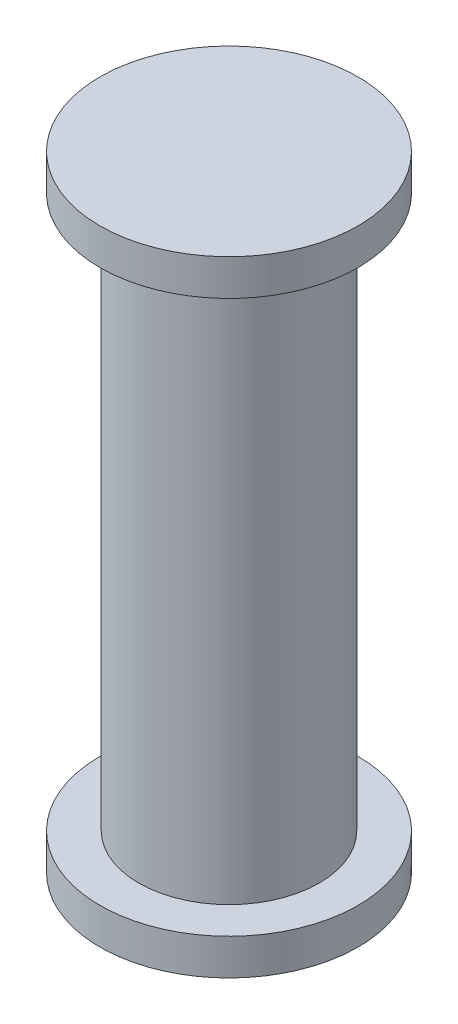
ISO-10303-21;
HEADER;
FILE_DESCRIPTION(('STEP AP214'),'2;1');
FILE_NAME('part.step','',(''),(''),'','','');
FILE_SCHEMA(('AUTOMOTIVE_DESIGN { 1 0 10303 214 1 1 1 1 }'));
ENDSEC;
DATA;
#1=APPLICATION_CONTEXT('core data for automotive mechanical design processes');
#2=APPLICATION_PROTOCOL_DEFINITION('international standard','automotive_design',2000,#1);
#3=PRODUCT_CONTEXT('',#1,'mechanical');
#4=PRODUCT('Part','Part','',(#3));
#5=PRODUCT_RELATED_PRODUCT_CATEGORY('part','',(#4));
#6=PRODUCT_DEFINITION_FORMATION('','',#4);
#7=PRODUCT_DEFINITION_CONTEXT('part definition',#1,'design');
#8=PRODUCT_DEFINITION('design','',#6,#7);
#9=PRODUCT_DEFINITION_SHAPE('','',#8);
#10=(LENGTH_UNIT() NAMED_UNIT(*) SI_UNIT(.MILLI.,.METRE.));
#11=(NAMED_UNIT(*) PLANE_ANGLE_UNIT() SI_UNIT($,.RADIAN.));
#12=(NAMED_UNIT(*) SI_UNIT($,.STERADIAN.) SOLID_ANGLE_UNIT());
#13=UNCERTAINTY_MEASURE_WITH_UNIT(LENGTH_MEASURE(1.E-05),#10,'distance_accuracy_value','');
#14=(GEOMETRIC_REPRESENTATION_CONTEXT(3) GLOBAL_UNCERTAINTY_ASSIGNED_CONTEXT((#13)) GLOBAL_UNIT_ASSIGNED_CONTEXT((#10,
#11,#12)) REPRESENTATION_CONTEXT('',''));
#15=CARTESIAN_POINT('',(0.,0.,0.));
#16=DIRECTION('',(0.,0.,1.));
#17=DIRECTION('',(1.,0.,0.));
#18=AXIS2_PLACEMENT_3D('',#15,#16,#17);
#19=CARTESIAN_POINT('',(0.,10.7,0.));
#20=DIRECTION('',(0.,-1.,0.));
#21=DIRECTION('',(0.,0.,-1.));
#22=AXIS2_PLACEMENT_3D('',#19,#20,#21);
#23=CYLINDRICAL_SURFACE('',#22,1.75);
#24=CARTESIAN_POINT('',(0.,10.7,0.));
#25=DIRECTION('',(0.,1.,0.));
#26=DIRECTION('',(0.,0.,1.));
#27=AXIS2_PLACEMENT_3D('',#24,#25,#26);
#28=CIRCLE('',#27,1.75);
#29=CARTESIAN_POINT('',(0.,10.7,1.75));
#30=VERTEX_POINT('',#29);
#31=EDGE_CURVE('E10',#30,#30,#28,.T.);
#32=ORIENTED_EDGE('',*,*,#31,.F.);
#33=EDGE_LOOP('',(#32));
#34=FACE_BOUND('',#33,.T.);
#35=CARTESIAN_POINT('',(0.,0.,0.));
#36=DIRECTION('',(0.,1.,0.));
#37=DIRECTION('',(0.,0.,1.));
#38=AXIS2_PLACEMENT_3D('',#35,#36,#37);
#39=CIRCLE('',#38,1.75);
#40=CARTESIAN_POINT('',(0.,0.,1.75));
#41=VERTEX_POINT('',#40);
#42=EDGE_CURVE('E48',#41,#41,#39,.T.);
#43=ORIENTED_EDGE('',*,*,#42,.T.);
#44=EDGE_LOOP('',(#43));
#45=FACE_BOUND('',#44,.T.);
#46=ADVANCED_FACE('F45',(#34,#45),#23,.T.);
#47=CARTESIAN_POINT('',(0.,11.4,0.));
#48=DIRECTION('',(0.,-1.,0.));
#49=DIRECTION('',(0.,0.,-1.));
#50=AXIS2_PLACEMENT_3D('',#47,#48,#49);
#51=CYLINDRICAL_SURFACE('',#50,2.5);
#52=CARTESIAN_POINT('',(0.,11.4,0.));
#53=DIRECTION('',(0.,1.,0.));
#54=DIRECTION('',(0.,0.,1.));
#55=AXIS2_PLACEMENT_3D('',#52,#53,#54);
#56=CIRCLE('',#55,2.5);
#57=CARTESIAN_POINT('',(0.,11.4,2.5));
#58=VERTEX_POINT('',#57);
#59=EDGE_CURVE('E53',#58,#58,#56,.T.);
#60=ORIENTED_EDGE('',*,*,#59,.F.);
#61=EDGE_LOOP('',(#60));
#62=FACE_BOUND('',#61,.T.);
#63=CARTESIAN_POINT('',(0.,10.7,0.));
#64=DIRECTION('',(0.,1.,0.));
#65=DIRECTION('',(0.,0.,1.));
#66=AXIS2_PLACEMENT_3D('',#63,#64,#65);
#67=CIRCLE('',#66,2.5);
#68=CARTESIAN_POINT('',(0.,10.7,2.5));
#69=VERTEX_POINT('',#68);
#70=EDGE_CURVE('E58',#69,#69,#67,.T.);
#71=ORIENTED_EDGE('',*,*,#70,.T.);
#72=EDGE_LOOP('',(#71));
#73=FACE_BOUND('',#72,.T.);
#74=ADVANCED_FACE('F99',(#62,#73),#51,.T.);
#75=CARTESIAN_POINT('',(0.,11.4,0.));
#76=DIRECTION('',(0.,1.,0.));
#77=DIRECTION('',(0.,0.,1.));
#78=AXIS2_PLACEMENT_3D('',#75,#76,#77);
#79=PLANE('',#78);
#80=ORIENTED_EDGE('',*,*,#59,.T.);
#81=EDGE_LOOP('',(#80));
#82=FACE_BOUND('',#81,.T.);
#83=ADVANCED_FACE('F95',(#82),#79,.T.);
#84=CARTESIAN_POINT('',(0.,10.7,0.));
#85=DIRECTION('',(0.,1.,0.));
#86=DIRECTION('',(0.,0.,1.));
#87=AXIS2_PLACEMENT_3D('',#84,#85,#86);
#88=PLANE('',#87);
#89=ORIENTED_EDGE('',*,*,#31,.T.);
#90=EDGE_LOOP('',(#89));
#91=FACE_BOUND('',#90,.T.);
#92=ORIENTED_EDGE('',*,*,#70,.F.);
#93=EDGE_LOOP('',(#92));
#94=FACE_BOUND('',#93,.T.);
#95=ADVANCED_FACE('F87',(#91,#94),#88,.F.);
#96=CARTESIAN_POINT('',(0.,-0.7,0.));
#97=DIRECTION('',(0.,1.,0.));
#98=DIRECTION('',(0.,0.,1.));
#99=AXIS2_PLACEMENT_3D('',#96,#97,#98);
#100=CYLINDRICAL_SURFACE('',#99,2.5);
#101=CARTESIAN_POINT('',(0.,-0.7,0.));
#102=DIRECTION('',(0.,-1.,0.));
#103=DIRECTION('',(0.,0.,-1.));
#104=AXIS2_PLACEMENT_3D('',#101,#102,#103);
#105=CIRCLE('',#104,2.5);
#106=CARTESIAN_POINT('',(0.,-0.7,-2.5));
#107=VERTEX_POINT('',#106);
#108=EDGE_CURVE('E68',#107,#107,#105,.T.);
#109=ORIENTED_EDGE('',*,*,#108,.F.);
#110=EDGE_LOOP('',(#109));
#111=FACE_BOUND('',#110,.T.);
#112=CARTESIAN_POINT('',(0.,0.,0.));
#113=DIRECTION('',(0.,-1.,0.));
#114=DIRECTION('',(0.,0.,-1.));
#115=AXIS2_PLACEMENT_3D('',#112,#113,#114);
#116=CIRCLE('',#115,2.5);
#117=CARTESIAN_POINT('',(0.,0.,-2.5));
#118=VERTEX_POINT('',#117);
#119=EDGE_CURVE('E64',#118,#118,#116,.T.);
#120=ORIENTED_EDGE('',*,*,#119,.T.);
#121=EDGE_LOOP('',(#120));
#122=FACE_BOUND('',#121,.T.);
#123=ADVANCED_FACE('F85',(#111,#122),#100,.T.);
#124=CARTESIAN_POINT('',(0.,-0.7,0.));
#125=DIRECTION('',(0.,-1.,0.));
#126=DIRECTION('',(0.,0.,-1.));
#127=AXIS2_PLACEMENT_3D('',#124,#125,#126);
#128=PLANE('',#127);
#129=ORIENTED_EDGE('',*,*,#108,.T.);
#130=EDGE_LOOP('',(#129));
#131=FACE_BOUND('',#130,.T.);
#132=ADVANCED_FACE('F81',(#131),#128,.T.);
#133=CARTESIAN_POINT('',(0.,0.,0.));
#134=DIRECTION('',(0.,-1.,0.));
#135=DIRECTION('',(0.,0.,-1.));
#136=AXIS2_PLACEMENT_3D('',#133,#134,#135);
#137=PLANE('',#136);
#138=ORIENTED_EDGE('',*,*,#42,.F.);
#139=EDGE_LOOP('',(#138));
#140=FACE_BOUND('',#139,.T.);
#141=ORIENTED_EDGE('',*,*,#119,.F.);
#142=EDGE_LOOP('',(#141));
#143=FACE_BOUND('',#142,.T.);
#144=ADVANCED_FACE('F78',(#140,#143),#137,.F.);
#145=CLOSED_SHELL('',(#46,#74,#83,#95,#123,#132,#144));
#146=MANIFOLD_SOLID_BREP('B2',#145);
#147=ADVANCED_BREP_SHAPE_REPRESENTATION('',(#18,#146),#14);
#148=SHAPE_DEFINITION_REPRESENTATION(#9,#147);
ENDSEC;
END-ISO-10303-21;
